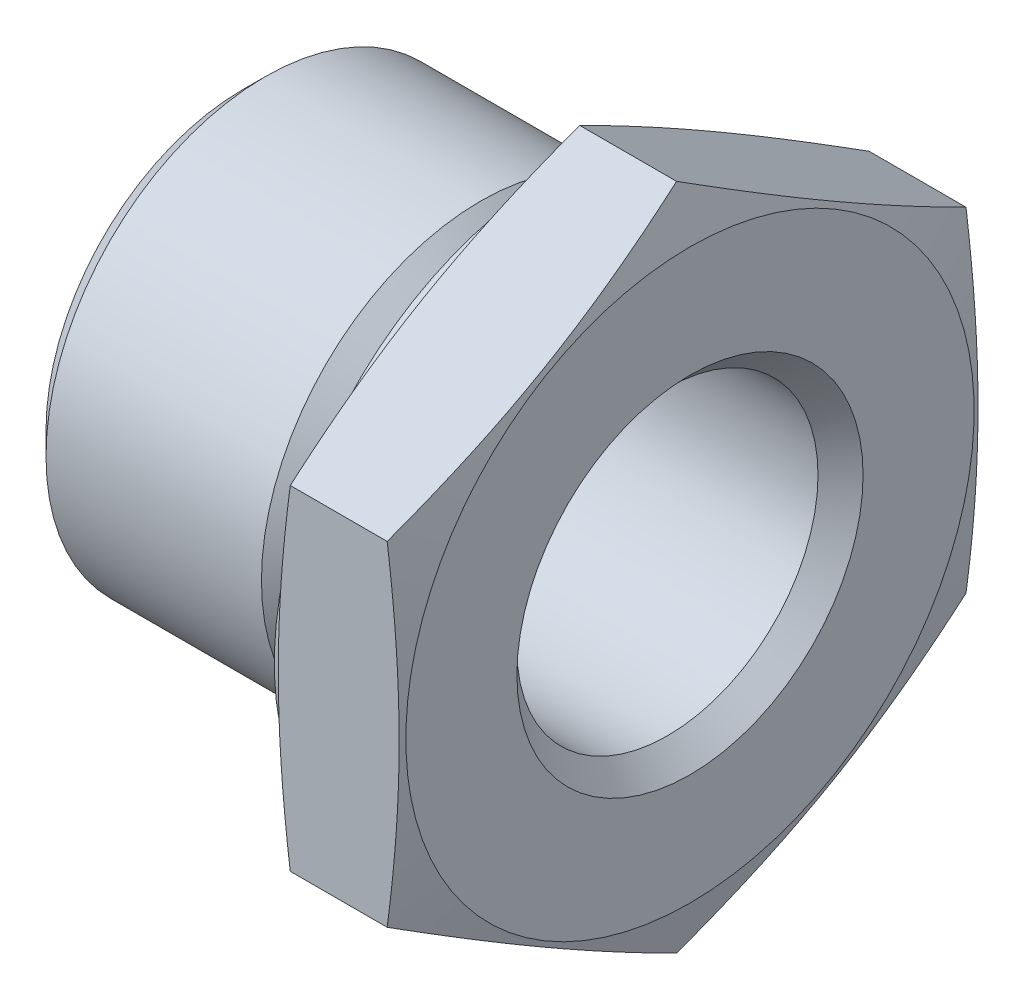
ISO-10303-21;
HEADER;
FILE_DESCRIPTION(('STEP AP214'),'2;1');
FILE_NAME('part.step','',(''),(''),'','','');
FILE_SCHEMA(('AUTOMOTIVE_DESIGN { 1 0 10303 214 1 1 1 1 }'));
ENDSEC;
DATA;
#1=APPLICATION_CONTEXT('core data for automotive mechanical design processes');
#2=APPLICATION_PROTOCOL_DEFINITION('international standard','automotive_design',2000,#1);
#3=PRODUCT_CONTEXT('',#1,'mechanical');
#4=PRODUCT('Part','Part','',(#3));
#5=PRODUCT_RELATED_PRODUCT_CATEGORY('part','',(#4));
#6=PRODUCT_DEFINITION_FORMATION('','',#4);
#7=PRODUCT_DEFINITION_CONTEXT('part definition',#1,'design');
#8=PRODUCT_DEFINITION('design','',#6,#7);
#9=PRODUCT_DEFINITION_SHAPE('','',#8);
#10=(LENGTH_UNIT() NAMED_UNIT(*) SI_UNIT(.MILLI.,.METRE.));
#11=(NAMED_UNIT(*) PLANE_ANGLE_UNIT() SI_UNIT($,.RADIAN.));
#12=(NAMED_UNIT(*) SI_UNIT($,.STERADIAN.) SOLID_ANGLE_UNIT());
#13=UNCERTAINTY_MEASURE_WITH_UNIT(LENGTH_MEASURE(1.E-05),#10,'distance_accuracy_value','');
#14=(GEOMETRIC_REPRESENTATION_CONTEXT(3) GLOBAL_UNCERTAINTY_ASSIGNED_CONTEXT((#13)) GLOBAL_UNIT_ASSIGNED_CONTEXT((#10,
#11,#12)) REPRESENTATION_CONTEXT('',''));
#15=CARTESIAN_POINT('',(0.,0.,0.));
#16=DIRECTION('',(0.,0.,1.));
#17=DIRECTION('',(1.,0.,0.));
#18=AXIS2_PLACEMENT_3D('',#15,#16,#17);
#19=CARTESIAN_POINT('',(17.,5.4,0.));
#20=DIRECTION('',(1.,0.,0.));
#21=DIRECTION('',(0.,1.,0.));
#22=AXIS2_PLACEMENT_3D('',#19,#20,#21);
#23=PLANE('',#22);
#24=CARTESIAN_POINT('',(17.,0.,0.));
#25=DIRECTION('',(1.,0.,0.));
#26=DIRECTION('',(0.,1.,0.));
#27=AXIS2_PLACEMENT_3D('',#24,#25,#26);
#28=CIRCLE('',#27,10.8);
#29=CARTESIAN_POINT('',(17.,10.8,0.));
#30=VERTEX_POINT('',#29);
#31=EDGE_CURVE('E18',#30,#30,#28,.T.);
#32=ORIENTED_EDGE('',*,*,#31,.T.);
#33=EDGE_LOOP('',(#32));
#34=FACE_BOUND('',#33,.T.);
#35=CARTESIAN_POINT('',(17.,0.,0.));
#36=DIRECTION('',(-1.,0.,0.));
#37=DIRECTION('',(0.,-1.,0.));
#38=AXIS2_PLACEMENT_3D('',#35,#36,#37);
#39=CIRCLE('',#38,6.5785);
#40=CARTESIAN_POINT('',(17.,6.5785,0.));
#41=VERTEX_POINT('',#40);
#42=EDGE_CURVE('E116',#41,#41,#39,.T.);
#43=ORIENTED_EDGE('',*,*,#42,.T.);
#44=EDGE_LOOP('',(#43));
#45=FACE_BOUND('',#44,.T.);
#46=ADVANCED_FACE('F15',(#34,#45),#23,.T.);
#47=CARTESIAN_POINT('',(12.15,0.,0.));
#48=DIRECTION('',(-1.,0.,0.));
#49=DIRECTION('',(0.,1.,0.));
#50=AXIS2_PLACEMENT_3D('',#47,#48,#49);
#51=CYLINDRICAL_SURFACE('',#50,10.8);
#52=CARTESIAN_POINT('',(12.,0.,0.));
#53=DIRECTION('',(1.,0.,0.));
#54=DIRECTION('',(0.,1.,0.));
#55=AXIS2_PLACEMENT_3D('',#52,#53,#54);
#56=CIRCLE('',#55,10.8);
#57=CARTESIAN_POINT('',(12.,10.8,0.));
#58=VERTEX_POINT('',#57);
#59=EDGE_CURVE('E9',#58,#58,#56,.T.);
#60=ORIENTED_EDGE('',*,*,#59,.T.);
#61=EDGE_LOOP('',(#60));
#62=FACE_BOUND('',#61,.T.);
#63=CARTESIAN_POINT('',(12.3,0.,0.));
#64=DIRECTION('',(1.,0.,0.));
#65=DIRECTION('',(0.,1.,0.));
#66=AXIS2_PLACEMENT_3D('',#63,#64,#65);
#67=CIRCLE('',#66,10.8);
#68=CARTESIAN_POINT('',(12.3,10.8,0.));
#69=VERTEX_POINT('',#68);
#70=EDGE_CURVE('E69',#69,#69,#67,.T.);
#71=ORIENTED_EDGE('',*,*,#70,.F.);
#72=EDGE_LOOP('',(#71));
#73=FACE_BOUND('',#72,.T.);
#74=ADVANCED_FACE('F281',(#62,#73),#51,.T.);
#75=CARTESIAN_POINT('',(12.,9.5655,0.));
#76=DIRECTION('',(-1.,0.,0.));
#77=DIRECTION('',(0.,-1.,0.));
#78=AXIS2_PLACEMENT_3D('',#75,#76,#77);
#79=PLANE('',#78);
#80=CARTESIAN_POINT('',(12.,0.,0.));
#81=DIRECTION('',(1.,0.,0.));
#82=DIRECTION('',(0.,1.,0.));
#83=AXIS2_PLACEMENT_3D('',#80,#81,#82);
#84=CIRCLE('',#83,8.331);
#85=CARTESIAN_POINT('',(12.,8.331,0.));
#86=VERTEX_POINT('',#85);
#87=EDGE_CURVE('E24',#86,#86,#84,.T.);
#88=ORIENTED_EDGE('',*,*,#87,.T.);
#89=EDGE_LOOP('',(#88));
#90=FACE_BOUND('',#89,.T.);
#91=ORIENTED_EDGE('',*,*,#59,.F.);
#92=EDGE_LOOP('',(#91));
#93=FACE_BOUND('',#92,.T.);
#94=ADVANCED_FACE('F285',(#90,#93),#79,.T.);
#95=CARTESIAN_POINT('',(10.95,0.,0.));
#96=DIRECTION('',(1.,0.,0.));
#97=DIRECTION('',(0.,1.,0.));
#98=AXIS2_PLACEMENT_3D('',#95,#96,#97);
#99=CONICAL_SURFACE('',#98,7.903,0.387057216912288);
#100=CARTESIAN_POINT('',(9.9,0.,0.));
#101=DIRECTION('',(1.,0.,0.));
#102=DIRECTION('',(0.,1.,0.));
#103=AXIS2_PLACEMENT_3D('',#100,#101,#102);
#104=CIRCLE('',#103,7.475);
#105=CARTESIAN_POINT('',(9.9,7.475,0.));
#106=VERTEX_POINT('',#105);
#107=EDGE_CURVE('E138',#106,#106,#104,.T.);
#108=ORIENTED_EDGE('',*,*,#107,.T.);
#109=EDGE_LOOP('',(#108));
#110=FACE_BOUND('',#109,.T.);
#111=ORIENTED_EDGE('',*,*,#87,.F.);
#112=EDGE_LOOP('',(#111));
#113=FACE_BOUND('',#112,.T.);
#114=ADVANCED_FACE('F276',(#110,#113),#99,.T.);
#115=CARTESIAN_POINT('',(9.472,0.,0.));
#116=DIRECTION('',(-1.,0.,0.));
#117=DIRECTION('',(0.,1.,0.));
#118=AXIS2_PLACEMENT_3D('',#115,#116,#117);
#119=CONICAL_SURFACE('',#118,7.903,0.785398163397448);
#120=CARTESIAN_POINT('',(9.044,0.,0.));
#121=DIRECTION('',(1.,0.,0.));
#122=DIRECTION('',(0.,1.,0.));
#123=AXIS2_PLACEMENT_3D('',#120,#121,#122);
#124=CIRCLE('',#123,8.331);
#125=CARTESIAN_POINT('',(9.044,8.331,0.));
#126=VERTEX_POINT('',#125);
#127=EDGE_CURVE('E175',#126,#126,#124,.T.);
#128=ORIENTED_EDGE('',*,*,#127,.T.);
#129=EDGE_LOOP('',(#128));
#130=FACE_BOUND('',#129,.T.);
#131=ORIENTED_EDGE('',*,*,#107,.F.);
#132=EDGE_LOOP('',(#131));
#133=FACE_BOUND('',#132,.T.);
#134=ADVANCED_FACE('F260',(#130,#133),#119,.T.);
#135=CARTESIAN_POINT('',(4.95,0.,0.));
#136=DIRECTION('',(-1.,0.,0.));
#137=DIRECTION('',(0.,1.,0.));
#138=AXIS2_PLACEMENT_3D('',#135,#136,#137);
#139=CYLINDRICAL_SURFACE('',#138,8.331);
#140=CARTESIAN_POINT('',(0.856,0.,0.));
#141=DIRECTION('',(1.,0.,0.));
#142=DIRECTION('',(0.,1.,0.));
#143=AXIS2_PLACEMENT_3D('',#140,#141,#142);
#144=CIRCLE('',#143,8.331);
#145=CARTESIAN_POINT('',(0.856,8.331,0.));
#146=VERTEX_POINT('',#145);
#147=EDGE_CURVE('E173',#146,#146,#144,.T.);
#148=ORIENTED_EDGE('',*,*,#147,.T.);
#149=EDGE_LOOP('',(#148));
#150=FACE_BOUND('',#149,.T.);
#151=ORIENTED_EDGE('',*,*,#127,.F.);
#152=EDGE_LOOP('',(#151));
#153=FACE_BOUND('',#152,.T.);
#154=ADVANCED_FACE('F263',(#150,#153),#139,.T.);
#155=CARTESIAN_POINT('',(0.428,0.,0.));
#156=DIRECTION('',(1.,0.,0.));
#157=DIRECTION('',(0.,1.,0.));
#158=AXIS2_PLACEMENT_3D('',#155,#156,#157);
#159=CONICAL_SURFACE('',#158,7.903,0.785398163397448);
#160=CARTESIAN_POINT('',(0.,0.,0.));
#161=DIRECTION('',(1.,0.,0.));
#162=DIRECTION('',(0.,1.,0.));
#163=AXIS2_PLACEMENT_3D('',#160,#161,#162);
#164=CIRCLE('',#163,7.475);
#165=CARTESIAN_POINT('',(0.,7.475,0.));
#166=VERTEX_POINT('',#165);
#167=EDGE_CURVE('E176',#166,#166,#164,.T.);
#168=ORIENTED_EDGE('',*,*,#167,.T.);
#169=EDGE_LOOP('',(#168));
#170=FACE_BOUND('',#169,.T.);
#171=ORIENTED_EDGE('',*,*,#147,.F.);
#172=EDGE_LOOP('',(#171));
#173=FACE_BOUND('',#172,.T.);
#174=ADVANCED_FACE('F265',(#170,#173),#159,.T.);
#175=CARTESIAN_POINT('',(0.,3.7375,0.));
#176=DIRECTION('',(-1.,0.,0.));
#177=DIRECTION('',(0.,-1.,0.));
#178=AXIS2_PLACEMENT_3D('',#175,#176,#177);
#179=PLANE('',#178);
#180=ORIENTED_EDGE('',*,*,#167,.F.);
#181=EDGE_LOOP('',(#180));
#182=FACE_BOUND('',#181,.T.);
#183=CARTESIAN_POINT('',(0.,0.,0.));
#184=DIRECTION('',(1.,0.,0.));
#185=DIRECTION('',(0.,-1.,0.));
#186=AXIS2_PLACEMENT_3D('',#183,#184,#185);
#187=CIRCLE('',#186,6.70399545762236);
#188=CARTESIAN_POINT('',(0.,6.70399545762236,0.));
#189=VERTEX_POINT('',#188);
#190=EDGE_CURVE('E121',#189,#189,#187,.T.);
#191=ORIENTED_EDGE('',*,*,#190,.T.);
#192=EDGE_LOOP('',(#191));
#193=FACE_BOUND('',#192,.T.);
#194=ADVANCED_FACE('F273',(#182,#193),#179,.T.);
#195=CARTESIAN_POINT('',(16.1458971511617,0.,0.));
#196=DIRECTION('',(-1.,0.,0.));
#197=DIRECTION('',(0.,1.,0.));
#198=AXIS2_PLACEMENT_3D('',#195,#196,#197);
#199=CONICAL_SURFACE('',#198,13.9875552267539,1.30899693899575);
#200=CARTESIAN_POINT('',(15.2917943023233,-16.1214371177233,-5.92314817892363));
#201=CARTESIAN_POINT('',(18.0061282052704,-9.52627944162882,5.50000000000001));
#202=CARTESIAN_POINT('',(15.2917943023233,-2.93112176553428,16.9231481789237));
#203=(BOUNDED_CURVE() B_SPLINE_CURVE(2,(#200,#201,#202),.UNSPECIFIED.,.F.,
.F.) B_SPLINE_CURVE_WITH_KNOTS((3,3),(0.,26.5873784139527),
.UNSPECIFIED.) CURVE() GEOMETRIC_REPRESENTATION_ITEM() RATIONAL_B_SPLINE_CURVE((1.,
1.56137367759162,1.)) REPRESENTATION_ITEM(''));
#204=CARTESIAN_POINT('',(16.4904394339126,-12.7017059221718,0.));
#205=VERTEX_POINT('',#204);
#206=CARTESIAN_POINT('',(16.4904394339126,-6.35085296108588,11.));
#207=VERTEX_POINT('',#206);
#208=EDGE_CURVE('E168',#205,#207,#203,.T.);
#209=ORIENTED_EDGE('',*,*,#208,.F.);
#210=CARTESIAN_POINT('',(15.2917943023233,-2.93112176553428,-16.9231481789237));
#211=CARTESIAN_POINT('',(18.0061282052704,-9.52627944162882,-5.50000000000001));
#212=CARTESIAN_POINT('',(15.2917943023233,-16.1214371177233,5.92314817892363));
#213=(BOUNDED_CURVE() B_SPLINE_CURVE(2,(#210,#211,#212),.UNSPECIFIED.,.F.,
.F.) B_SPLINE_CURVE_WITH_KNOTS((3,3),(0.,26.5873784139527),
.UNSPECIFIED.) CURVE() GEOMETRIC_REPRESENTATION_ITEM() RATIONAL_B_SPLINE_CURVE((1.,
1.56137367759162,1.)) REPRESENTATION_ITEM(''));
#214=CARTESIAN_POINT('',(16.4904394339126,-6.35085296108588,-11.));
#215=VERTEX_POINT('',#214);
#216=EDGE_CURVE('E63',#215,#205,#213,.T.);
#217=ORIENTED_EDGE('',*,*,#216,.F.);
#218=CARTESIAN_POINT('',(15.2917943023233,13.1903153521891,-11.));
#219=CARTESIAN_POINT('',(18.0061282052704,0.,-11.));
#220=CARTESIAN_POINT('',(15.2917943023233,-13.1903153521891,-11.));
#221=(BOUNDED_CURVE() B_SPLINE_CURVE(2,(#218,#219,#220),.UNSPECIFIED.,.F.,
.F.) B_SPLINE_CURVE_WITH_KNOTS((3,3),(0.,26.5873784139527),
.UNSPECIFIED.) CURVE() GEOMETRIC_REPRESENTATION_ITEM() RATIONAL_B_SPLINE_CURVE((1.,
1.56137367759162,1.)) REPRESENTATION_ITEM(''));
#222=CARTESIAN_POINT('',(16.4904394339126,6.35085296108588,-11.));
#223=VERTEX_POINT('',#222);
#224=EDGE_CURVE('E108',#223,#215,#221,.T.);
#225=ORIENTED_EDGE('',*,*,#224,.F.);
#226=CARTESIAN_POINT('',(15.2917943023233,16.1214371177233,5.92314817892362));
#227=CARTESIAN_POINT('',(18.0061282052704,9.52627944162882,-5.50000000000001));
#228=CARTESIAN_POINT('',(15.2917943023233,2.93112176553428,-16.9231481789237));
#229=(BOUNDED_CURVE() B_SPLINE_CURVE(2,(#226,#227,#228),.UNSPECIFIED.,.F.,
.F.) B_SPLINE_CURVE_WITH_KNOTS((3,3),(0.,26.5873784139527),
.UNSPECIFIED.) CURVE() GEOMETRIC_REPRESENTATION_ITEM() RATIONAL_B_SPLINE_CURVE((1.,
1.56137367759162,1.)) REPRESENTATION_ITEM(''));
#230=CARTESIAN_POINT('',(16.4904394339126,12.7017059221718,0.));
#231=VERTEX_POINT('',#230);
#232=EDGE_CURVE('E128',#231,#223,#229,.T.);
#233=ORIENTED_EDGE('',*,*,#232,.F.);
#234=CARTESIAN_POINT('',(15.2917943023233,2.93112176553429,16.9231481789237));
#235=CARTESIAN_POINT('',(18.0061282052704,9.52627944162884,5.5));
#236=CARTESIAN_POINT('',(15.2917943023233,16.1214371177233,-5.92314817892363));
#237=(BOUNDED_CURVE() B_SPLINE_CURVE(2,(#234,#235,#236),.UNSPECIFIED.,.F.,
.F.) B_SPLINE_CURVE_WITH_KNOTS((3,3),(0.,26.5873784139527),
.UNSPECIFIED.) CURVE() GEOMETRIC_REPRESENTATION_ITEM() RATIONAL_B_SPLINE_CURVE((1.,
1.56137367759162,1.)) REPRESENTATION_ITEM(''));
#238=CARTESIAN_POINT('',(16.4904394339126,6.35085296108589,11.));
#239=VERTEX_POINT('',#238);
#240=EDGE_CURVE('E130',#239,#231,#237,.T.);
#241=ORIENTED_EDGE('',*,*,#240,.F.);
#242=CARTESIAN_POINT('',(15.2917943023233,-13.1903153521891,11.));
#243=CARTESIAN_POINT('',(18.0061282052704,0.,11.));
#244=CARTESIAN_POINT('',(15.2917943023233,13.1903153521891,11.));
#245=(BOUNDED_CURVE() B_SPLINE_CURVE(2,(#242,#243,#244),.UNSPECIFIED.,.F.,
.F.) B_SPLINE_CURVE_WITH_KNOTS((3,3),(0.,26.5873784139527),
.UNSPECIFIED.) CURVE() GEOMETRIC_REPRESENTATION_ITEM() RATIONAL_B_SPLINE_CURVE((1.,
1.56137367759162,1.)) REPRESENTATION_ITEM(''));
#246=EDGE_CURVE('E180',#207,#239,#245,.T.);
#247=ORIENTED_EDGE('',*,*,#246,.F.);
#248=EDGE_LOOP('',(#209,#217,#225,#233,#241,#247));
#249=FACE_BOUND('',#248,.T.);
#250=ORIENTED_EDGE('',*,*,#31,.F.);
#251=EDGE_LOOP('',(#250));
#252=FACE_BOUND('',#251,.T.);
#253=ADVANCED_FACE('F207',(#249,#252),#199,.T.);
#254=CARTESIAN_POINT('',(13.1541028488383,0.,0.));
#255=DIRECTION('',(1.,0.,0.));
#256=DIRECTION('',(0.,1.,0.));
#257=AXIS2_PLACEMENT_3D('',#254,#255,#256);
#258=CONICAL_SURFACE('',#257,13.9875552267539,1.30899693899575);
#259=CARTESIAN_POINT('',(14.0082056976766,-2.93112176553429,16.9231481789236));
#260=CARTESIAN_POINT('',(11.2938717947296,-9.52627944162882,5.5));
#261=CARTESIAN_POINT('',(14.0082056976766,-16.1214371177233,-5.92314817892361));
#262=(BOUNDED_CURVE() B_SPLINE_CURVE(2,(#259,#260,#261),.UNSPECIFIED.,.F.,
.F.) B_SPLINE_CURVE_WITH_KNOTS((3,3),(0.,26.5873784139526),
.UNSPECIFIED.) CURVE() GEOMETRIC_REPRESENTATION_ITEM() RATIONAL_B_SPLINE_CURVE((1.,
1.56137367759162,1.)) REPRESENTATION_ITEM(''));
#263=CARTESIAN_POINT('',(12.8095605660874,-6.35085296108588,11.));
#264=VERTEX_POINT('',#263);
#265=CARTESIAN_POINT('',(12.8095605660874,-12.7017059221718,0.));
#266=VERTEX_POINT('',#265);
#267=EDGE_CURVE('E229',#264,#266,#262,.T.);
#268=ORIENTED_EDGE('',*,*,#267,.F.);
#269=CARTESIAN_POINT('',(14.0082056976766,13.1903153521891,11.));
#270=CARTESIAN_POINT('',(11.2938717947296,0.,11.));
#271=CARTESIAN_POINT('',(14.0082056976766,-13.1903153521891,11.));
#272=(BOUNDED_CURVE() B_SPLINE_CURVE(2,(#269,#270,#271),.UNSPECIFIED.,.F.,
.F.) B_SPLINE_CURVE_WITH_KNOTS((3,3),(0.,26.5873784139526),
.UNSPECIFIED.) CURVE() GEOMETRIC_REPRESENTATION_ITEM() RATIONAL_B_SPLINE_CURVE((1.,
1.56137367759162,1.)) REPRESENTATION_ITEM(''));
#273=CARTESIAN_POINT('',(12.8095605660874,6.35085296108589,11.));
#274=VERTEX_POINT('',#273);
#275=EDGE_CURVE('E103',#274,#264,#272,.T.);
#276=ORIENTED_EDGE('',*,*,#275,.F.);
#277=CARTESIAN_POINT('',(14.0082056976766,16.1214371177233,-5.92314817892362));
#278=CARTESIAN_POINT('',(11.2938717947297,9.52627944162884,5.49999999999998));
#279=CARTESIAN_POINT('',(14.0082056976766,2.9311217655343,16.9231481789236));
#280=(BOUNDED_CURVE() B_SPLINE_CURVE(2,(#277,#278,#279),.UNSPECIFIED.,.F.,
.F.) B_SPLINE_CURVE_WITH_KNOTS((3,3),(0.,26.5873784139526),
.UNSPECIFIED.) CURVE() GEOMETRIC_REPRESENTATION_ITEM() RATIONAL_B_SPLINE_CURVE((1.,
1.56137367759162,1.)) REPRESENTATION_ITEM(''));
#281=CARTESIAN_POINT('',(12.8095605660874,12.7017059221718,0.));
#282=VERTEX_POINT('',#281);
#283=EDGE_CURVE('E127',#282,#274,#280,.T.);
#284=ORIENTED_EDGE('',*,*,#283,.F.);
#285=CARTESIAN_POINT('',(14.0082056976766,2.93112176553429,-16.9231481789236));
#286=CARTESIAN_POINT('',(11.2938717947296,9.52627944162881,-5.5));
#287=CARTESIAN_POINT('',(14.0082056976766,16.1214371177233,5.92314817892361));
#288=(BOUNDED_CURVE() B_SPLINE_CURVE(2,(#285,#286,#287),.UNSPECIFIED.,.F.,
.F.) B_SPLINE_CURVE_WITH_KNOTS((3,3),(0.,26.5873784139526),
.UNSPECIFIED.) CURVE() GEOMETRIC_REPRESENTATION_ITEM() RATIONAL_B_SPLINE_CURVE((1.,
1.56137367759162,1.)) REPRESENTATION_ITEM(''));
#289=CARTESIAN_POINT('',(12.8095605660874,6.35085296108588,-11.));
#290=VERTEX_POINT('',#289);
#291=EDGE_CURVE('E119',#290,#282,#288,.T.);
#292=ORIENTED_EDGE('',*,*,#291,.F.);
#293=CARTESIAN_POINT('',(14.0082056976766,-13.1903153521891,-11.));
#294=CARTESIAN_POINT('',(11.2938717947296,0.,-11.));
#295=CARTESIAN_POINT('',(14.0082056976766,13.1903153521891,-11.));
#296=(BOUNDED_CURVE() B_SPLINE_CURVE(2,(#293,#294,#295),.UNSPECIFIED.,.F.,
.F.) B_SPLINE_CURVE_WITH_KNOTS((3,3),(0.,26.5873784139526),
.UNSPECIFIED.) CURVE() GEOMETRIC_REPRESENTATION_ITEM() RATIONAL_B_SPLINE_CURVE((1.,
1.56137367759162,1.)) REPRESENTATION_ITEM(''));
#297=CARTESIAN_POINT('',(12.8095605660874,-6.35085296108588,-11.));
#298=VERTEX_POINT('',#297);
#299=EDGE_CURVE('E165',#298,#290,#296,.T.);
#300=ORIENTED_EDGE('',*,*,#299,.F.);
#301=CARTESIAN_POINT('',(14.0082056976766,-16.1214371177233,5.92314817892362));
#302=CARTESIAN_POINT('',(11.2938717947296,-9.52627944162882,-5.5));
#303=CARTESIAN_POINT('',(14.0082056976766,-2.93112176553429,-16.9231481789236));
#304=(BOUNDED_CURVE() B_SPLINE_CURVE(2,(#301,#302,#303),.UNSPECIFIED.,.F.,
.F.) B_SPLINE_CURVE_WITH_KNOTS((3,3),(0.,26.5873784139526),
.UNSPECIFIED.) CURVE() GEOMETRIC_REPRESENTATION_ITEM() RATIONAL_B_SPLINE_CURVE((1.,
1.56137367759162,1.)) REPRESENTATION_ITEM(''));
#305=EDGE_CURVE('E141',#266,#298,#304,.T.);
#306=ORIENTED_EDGE('',*,*,#305,.F.);
#307=EDGE_LOOP('',(#268,#276,#284,#292,#300,#306));
#308=FACE_BOUND('',#307,.T.);
#309=ORIENTED_EDGE('',*,*,#70,.T.);
#310=EDGE_LOOP('',(#309));
#311=FACE_BOUND('',#310,.T.);
#312=ADVANCED_FACE('F311',(#308,#311),#258,.T.);
#313=CARTESIAN_POINT('',(-2.,-9.52627944162882,-5.5));
#314=DIRECTION('',(0.,-0.866025403784439,-0.5));
#315=DIRECTION('',(0.,0.5,-0.866025403784439));
#316=AXIS2_PLACEMENT_3D('',#313,#314,#315);
#317=PLANE('',#316);
#318=ORIENTED_EDGE('',*,*,#305,.T.);
#319=DIRECTION('',(1.,0.,0.));
#320=VECTOR('',#319,1.);
#321=CARTESIAN_POINT('',(-2.,-6.35085296108588,-11.));
#322=LINE('',#321,#320);
#323=EDGE_CURVE('E147',#298,#215,#322,.T.);
#324=ORIENTED_EDGE('',*,*,#323,.T.);
#325=ORIENTED_EDGE('',*,*,#216,.T.);
#326=DIRECTION('',(1.,0.,0.));
#327=VECTOR('',#326,1.);
#328=CARTESIAN_POINT('',(-2.,-12.7017059221718,0.));
#329=LINE('',#328,#327);
#330=EDGE_CURVE('E230',#266,#205,#329,.T.);
#331=ORIENTED_EDGE('',*,*,#330,.F.);
#332=EDGE_LOOP('',(#318,#324,#325,#331));
#333=FACE_BOUND('',#332,.T.);
#334=ADVANCED_FACE('F303',(#333),#317,.T.);
#335=CARTESIAN_POINT('',(-2.,0.,-11.));
#336=DIRECTION('',(0.,0.,-1.));
#337=DIRECTION('',(0.,1.,0.));
#338=AXIS2_PLACEMENT_3D('',#335,#336,#337);
#339=PLANE('',#338);
#340=ORIENTED_EDGE('',*,*,#299,.T.);
#341=DIRECTION('',(1.,0.,0.));
#342=VECTOR('',#341,1.);
#343=CARTESIAN_POINT('',(-2.,6.35085296108588,-11.));
#344=LINE('',#343,#342);
#345=EDGE_CURVE('E125',#290,#223,#344,.T.);
#346=ORIENTED_EDGE('',*,*,#345,.T.);
#347=ORIENTED_EDGE('',*,*,#224,.T.);
#348=ORIENTED_EDGE('',*,*,#323,.F.);
#349=EDGE_LOOP('',(#340,#346,#347,#348));
#350=FACE_BOUND('',#349,.T.);
#351=ADVANCED_FACE('F198',(#350),#339,.T.);
#352=CARTESIAN_POINT('',(-2.,-9.52627944162882,5.5));
#353=DIRECTION('',(0.,-0.866025403784439,0.5));
#354=DIRECTION('',(0.,-0.5,-0.866025403784439));
#355=AXIS2_PLACEMENT_3D('',#352,#353,#354);
#356=PLANE('',#355);
#357=ORIENTED_EDGE('',*,*,#267,.T.);
#358=ORIENTED_EDGE('',*,*,#330,.T.);
#359=ORIENTED_EDGE('',*,*,#208,.T.);
#360=DIRECTION('',(1.,0.,0.));
#361=VECTOR('',#360,1.);
#362=CARTESIAN_POINT('',(-2.,-6.35085296108588,11.));
#363=LINE('',#362,#361);
#364=EDGE_CURVE('E177',#264,#207,#363,.T.);
#365=ORIENTED_EDGE('',*,*,#364,.F.);
#366=EDGE_LOOP('',(#357,#358,#359,#365));
#367=FACE_BOUND('',#366,.T.);
#368=ADVANCED_FACE('F227',(#367),#356,.T.);
#369=CARTESIAN_POINT('',(-2.,0.,11.));
#370=DIRECTION('',(0.,0.,1.));
#371=DIRECTION('',(0.,-1.,0.));
#372=AXIS2_PLACEMENT_3D('',#369,#370,#371);
#373=PLANE('',#372);
#374=ORIENTED_EDGE('',*,*,#275,.T.);
#375=ORIENTED_EDGE('',*,*,#364,.T.);
#376=ORIENTED_EDGE('',*,*,#246,.T.);
#377=DIRECTION('',(1.,0.,0.));
#378=VECTOR('',#377,1.);
#379=CARTESIAN_POINT('',(-2.,6.35085296108589,11.));
#380=LINE('',#379,#378);
#381=EDGE_CURVE('E134',#274,#239,#380,.T.);
#382=ORIENTED_EDGE('',*,*,#381,.F.);
#383=EDGE_LOOP('',(#374,#375,#376,#382));
#384=FACE_BOUND('',#383,.T.);
#385=ADVANCED_FACE('F222',(#384),#373,.T.);
#386=CARTESIAN_POINT('',(-2.,9.52627944162883,5.5));
#387=DIRECTION('',(0.,0.866025403784439,0.5));
#388=DIRECTION('',(0.,-0.5,0.866025403784439));
#389=AXIS2_PLACEMENT_3D('',#386,#387,#388);
#390=PLANE('',#389);
#391=ORIENTED_EDGE('',*,*,#283,.T.);
#392=ORIENTED_EDGE('',*,*,#381,.T.);
#393=ORIENTED_EDGE('',*,*,#240,.T.);
#394=DIRECTION('',(1.,0.,0.));
#395=VECTOR('',#394,1.);
#396=CARTESIAN_POINT('',(-2.,12.7017059221718,0.));
#397=LINE('',#396,#395);
#398=EDGE_CURVE('E181',#282,#231,#397,.T.);
#399=ORIENTED_EDGE('',*,*,#398,.F.);
#400=EDGE_LOOP('',(#391,#392,#393,#399));
#401=FACE_BOUND('',#400,.T.);
#402=ADVANCED_FACE('F212',(#401),#390,.T.);
#403=CARTESIAN_POINT('',(-2.,9.52627944162882,-5.5));
#404=DIRECTION('',(0.,0.866025403784439,-0.5));
#405=DIRECTION('',(0.,0.5,0.866025403784439));
#406=AXIS2_PLACEMENT_3D('',#403,#404,#405);
#407=PLANE('',#406);
#408=ORIENTED_EDGE('',*,*,#291,.T.);
#409=ORIENTED_EDGE('',*,*,#398,.T.);
#410=ORIENTED_EDGE('',*,*,#232,.T.);
#411=ORIENTED_EDGE('',*,*,#345,.F.);
#412=EDGE_LOOP('',(#408,#409,#410,#411));
#413=FACE_BOUND('',#412,.T.);
#414=ADVANCED_FACE('F204',(#413),#407,.T.);
#415=CARTESIAN_POINT('',(17.072,0.,0.));
#416=DIRECTION('',(1.,0.,0.));
#417=DIRECTION('',(0.,-1.,0.));
#418=AXIS2_PLACEMENT_3D('',#415,#416,#417);
#419=CONICAL_SURFACE('',#418,6.6505,0.785398163397448);
#420=CARTESIAN_POINT('',(16.144,0.,0.));
#421=DIRECTION('',(1.,0.,0.));
#422=DIRECTION('',(0.,-1.,0.));
#423=AXIS2_PLACEMENT_3D('',#420,#421,#422);
#424=CIRCLE('',#423,5.7225);
#425=CARTESIAN_POINT('',(16.144,-5.7225,0.));
#426=VERTEX_POINT('',#425);
#427=EDGE_CURVE('E113',#426,#426,#424,.T.);
#428=ORIENTED_EDGE('',*,*,#427,.F.);
#429=EDGE_LOOP('',(#428));
#430=FACE_BOUND('',#429,.T.);
#431=ORIENTED_EDGE('',*,*,#42,.F.);
#432=EDGE_LOOP('',(#431));
#433=FACE_BOUND('',#432,.T.);
#434=ADVANCED_FACE('F290',(#430,#433),#419,.F.);
#435=CARTESIAN_POINT('',(8.922,0.,0.));
#436=DIRECTION('',(-1.,0.,0.));
#437=DIRECTION('',(0.,-1.,0.));
#438=AXIS2_PLACEMENT_3D('',#435,#436,#437);
#439=CYLINDRICAL_SURFACE('',#438,5.7225);
#440=CARTESIAN_POINT('',(1.7,0.,0.));
#441=DIRECTION('',(1.,0.,0.));
#442=DIRECTION('',(0.,-1.,0.));
#443=AXIS2_PLACEMENT_3D('',#440,#441,#442);
#444=CIRCLE('',#443,5.7225);
#445=CARTESIAN_POINT('',(1.7,-5.7225,0.));
#446=VERTEX_POINT('',#445);
#447=EDGE_CURVE('E117',#446,#446,#444,.T.);
#448=ORIENTED_EDGE('',*,*,#447,.F.);
#449=EDGE_LOOP('',(#448));
#450=FACE_BOUND('',#449,.T.);
#451=ORIENTED_EDGE('',*,*,#427,.T.);
#452=EDGE_LOOP('',(#451));
#453=FACE_BOUND('',#452,.T.);
#454=ADVANCED_FACE('F114',(#450,#453),#439,.F.);
#455=CARTESIAN_POINT('',(0.35,0.,0.));
#456=DIRECTION('',(-1.,0.,0.));
#457=DIRECTION('',(0.,-1.,0.));
#458=AXIS2_PLACEMENT_3D('',#455,#456,#457);
#459=CONICAL_SURFACE('',#458,6.501922863406,0.523598775598299);
#460=ORIENTED_EDGE('',*,*,#447,.T.);
#461=EDGE_LOOP('',(#460));
#462=FACE_BOUND('',#461,.T.);
#463=ORIENTED_EDGE('',*,*,#190,.F.);
#464=EDGE_LOOP('',(#463));
#465=FACE_BOUND('',#464,.T.);
#466=ADVANCED_FACE('F297',(#462,#465),#459,.F.);
#467=CLOSED_SHELL('',(#46,#74,#94,#114,#134,#154,#174,#194,#253,#312,#334,#351,#368,#385,#402,
#414,#434,#454,#466));
#468=MANIFOLD_SOLID_BREP('B1',#467);
#469=ADVANCED_BREP_SHAPE_REPRESENTATION('',(#18,#468),#14);
#470=SHAPE_DEFINITION_REPRESENTATION(#9,#469);
ENDSEC;
END-ISO-10303-21;
